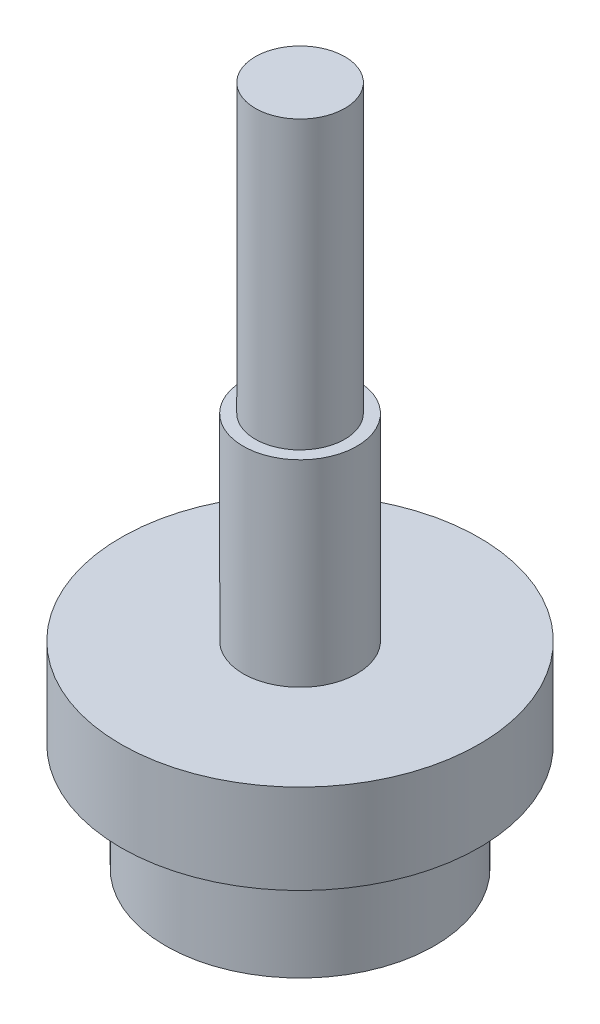
ISO-10303-21;
HEADER;
FILE_DESCRIPTION(('STEP AP214'),'2;1');
FILE_NAME('part.step','',(''),(''),'','','');
FILE_SCHEMA(('AUTOMOTIVE_DESIGN { 1 0 10303 214 1 1 1 1 }'));
ENDSEC;
DATA;
#1=APPLICATION_CONTEXT('core data for automotive mechanical design processes');
#2=APPLICATION_PROTOCOL_DEFINITION('international standard','automotive_design',2000,#1);
#3=PRODUCT_CONTEXT('',#1,'mechanical');
#4=PRODUCT('Part','Part','',(#3));
#5=PRODUCT_RELATED_PRODUCT_CATEGORY('part','',(#4));
#6=PRODUCT_DEFINITION_FORMATION('','',#4);
#7=PRODUCT_DEFINITION_CONTEXT('part definition',#1,'design');
#8=PRODUCT_DEFINITION('design','',#6,#7);
#9=PRODUCT_DEFINITION_SHAPE('','',#8);
#10=(LENGTH_UNIT() NAMED_UNIT(*) SI_UNIT(.MILLI.,.METRE.));
#11=(NAMED_UNIT(*) PLANE_ANGLE_UNIT() SI_UNIT($,.RADIAN.));
#12=(NAMED_UNIT(*) SI_UNIT($,.STERADIAN.) SOLID_ANGLE_UNIT());
#13=UNCERTAINTY_MEASURE_WITH_UNIT(LENGTH_MEASURE(1.E-05),#10,'distance_accuracy_value','');
#14=(GEOMETRIC_REPRESENTATION_CONTEXT(3) GLOBAL_UNCERTAINTY_ASSIGNED_CONTEXT((#13)) GLOBAL_UNIT_ASSIGNED_CONTEXT((#10,
#11,#12)) REPRESENTATION_CONTEXT('',''));
#15=CARTESIAN_POINT('',(0.,0.,0.));
#16=DIRECTION('',(0.,0.,1.));
#17=DIRECTION('',(1.,0.,0.));
#18=AXIS2_PLACEMENT_3D('',#15,#16,#17);
#19=CARTESIAN_POINT('',(0.,4.,0.));
#20=DIRECTION('',(0.,-1.,0.));
#21=DIRECTION('',(0.,0.,-1.));
#22=AXIS2_PLACEMENT_3D('',#19,#20,#21);
#23=CYLINDRICAL_SURFACE('',#22,2.5);
#24=CARTESIAN_POINT('',(0.,4.,0.));
#25=DIRECTION('',(0.,1.,0.));
#26=DIRECTION('',(0.,0.,1.));
#27=AXIS2_PLACEMENT_3D('',#24,#25,#26);
#28=CIRCLE('',#27,2.5);
#29=CARTESIAN_POINT('',(0.,4.,2.5));
#30=VERTEX_POINT('',#29);
#31=EDGE_CURVE('E39',#30,#30,#28,.T.);
#32=ORIENTED_EDGE('',*,*,#31,.F.);
#33=EDGE_LOOP('',(#32));
#34=FACE_BOUND('',#33,.T.);
#35=CARTESIAN_POINT('',(0.,1.,0.));
#36=DIRECTION('',(0.,-1.,0.));
#37=DIRECTION('',(0.,0.,-1.));
#38=AXIS2_PLACEMENT_3D('',#35,#36,#37);
#39=CIRCLE('',#38,2.5);
#40=CARTESIAN_POINT('',(0.,1.,-2.5));
#41=VERTEX_POINT('',#40);
#42=EDGE_CURVE('E88',#41,#41,#39,.T.);
#43=ORIENTED_EDGE('',*,*,#42,.F.);
#44=EDGE_LOOP('',(#43));
#45=FACE_BOUND('',#44,.T.);
#46=ADVANCED_FACE('F36',(#34,#45),#23,.T.);
#47=CARTESIAN_POINT('',(0.,10.,0.));
#48=DIRECTION('',(0.,-1.,0.));
#49=DIRECTION('',(0.,0.,-1.));
#50=AXIS2_PLACEMENT_3D('',#47,#48,#49);
#51=CYLINDRICAL_SURFACE('',#50,7.5);
#52=CARTESIAN_POINT('',(0.,10.,0.));
#53=DIRECTION('',(0.,1.,0.));
#54=DIRECTION('',(0.,0.,1.));
#55=AXIS2_PLACEMENT_3D('',#52,#53,#54);
#56=CIRCLE('',#55,7.5);
#57=CARTESIAN_POINT('',(0.,10.,7.5));
#58=VERTEX_POINT('',#57);
#59=EDGE_CURVE('E47',#58,#58,#56,.T.);
#60=ORIENTED_EDGE('',*,*,#59,.F.);
#61=EDGE_LOOP('',(#60));
#62=FACE_BOUND('',#61,.T.);
#63=CARTESIAN_POINT('',(0.,4.,0.));
#64=DIRECTION('',(0.,1.,0.));
#65=DIRECTION('',(0.,0.,1.));
#66=AXIS2_PLACEMENT_3D('',#63,#64,#65);
#67=CIRCLE('',#66,7.5);
#68=CARTESIAN_POINT('',(0.,4.,7.5));
#69=VERTEX_POINT('',#68);
#70=EDGE_CURVE('E55',#69,#69,#67,.T.);
#71=ORIENTED_EDGE('',*,*,#70,.T.);
#72=EDGE_LOOP('',(#71));
#73=FACE_BOUND('',#72,.T.);
#74=ADVANCED_FACE('F63',(#62,#73),#51,.T.);
#75=CARTESIAN_POINT('',(0.,4.,0.));
#76=DIRECTION('',(0.,1.,0.));
#77=DIRECTION('',(0.,0.,1.));
#78=AXIS2_PLACEMENT_3D('',#75,#76,#77);
#79=PLANE('',#78);
#80=ORIENTED_EDGE('',*,*,#31,.T.);
#81=EDGE_LOOP('',(#80));
#82=FACE_BOUND('',#81,.T.);
#83=ORIENTED_EDGE('',*,*,#70,.F.);
#84=EDGE_LOOP('',(#83));
#85=FACE_BOUND('',#84,.T.);
#86=ADVANCED_FACE('F65',(#82,#85),#79,.F.);
#87=CARTESIAN_POINT('',(0.,15.,0.));
#88=DIRECTION('',(0.,-1.,0.));
#89=DIRECTION('',(0.,0.,-1.));
#90=AXIS2_PLACEMENT_3D('',#87,#88,#89);
#91=CYLINDRICAL_SURFACE('',#90,10.);
#92=CARTESIAN_POINT('',(0.,15.,0.));
#93=DIRECTION('',(0.,1.,0.));
#94=DIRECTION('',(0.,0.,1.));
#95=AXIS2_PLACEMENT_3D('',#92,#93,#94);
#96=CIRCLE('',#95,10.);
#97=CARTESIAN_POINT('',(0.,15.,10.));
#98=VERTEX_POINT('',#97);
#99=EDGE_CURVE('E52',#98,#98,#96,.T.);
#100=ORIENTED_EDGE('',*,*,#99,.F.);
#101=EDGE_LOOP('',(#100));
#102=FACE_BOUND('',#101,.T.);
#103=CARTESIAN_POINT('',(0.,10.,0.));
#104=DIRECTION('',(0.,1.,0.));
#105=DIRECTION('',(0.,0.,1.));
#106=AXIS2_PLACEMENT_3D('',#103,#104,#105);
#107=CIRCLE('',#106,10.);
#108=CARTESIAN_POINT('',(0.,10.,10.));
#109=VERTEX_POINT('',#108);
#110=EDGE_CURVE('E56',#109,#109,#107,.T.);
#111=ORIENTED_EDGE('',*,*,#110,.T.);
#112=EDGE_LOOP('',(#111));
#113=FACE_BOUND('',#112,.T.);
#114=ADVANCED_FACE('F67',(#102,#113),#91,.T.);
#115=CARTESIAN_POINT('',(0.,15.,0.));
#116=DIRECTION('',(0.,1.,0.));
#117=DIRECTION('',(0.,0.,1.));
#118=AXIS2_PLACEMENT_3D('',#115,#116,#117);
#119=PLANE('',#118);
#120=CARTESIAN_POINT('',(0.,15.,0.));
#121=DIRECTION('',(0.,1.,0.));
#122=DIRECTION('',(0.,0.,1.));
#123=AXIS2_PLACEMENT_3D('',#120,#121,#122);
#124=CIRCLE('',#123,3.175);
#125=CARTESIAN_POINT('',(0.,15.,3.175));
#126=VERTEX_POINT('',#125);
#127=EDGE_CURVE('E10',#126,#126,#124,.T.);
#128=ORIENTED_EDGE('',*,*,#127,.F.);
#129=EDGE_LOOP('',(#128));
#130=FACE_BOUND('',#129,.T.);
#131=ORIENTED_EDGE('',*,*,#99,.T.);
#132=EDGE_LOOP('',(#131));
#133=FACE_BOUND('',#132,.T.);
#134=ADVANCED_FACE('F74',(#130,#133),#119,.T.);
#135=CARTESIAN_POINT('',(0.,10.,0.));
#136=DIRECTION('',(0.,1.,0.));
#137=DIRECTION('',(0.,0.,1.));
#138=AXIS2_PLACEMENT_3D('',#135,#136,#137);
#139=PLANE('',#138);
#140=ORIENTED_EDGE('',*,*,#59,.T.);
#141=EDGE_LOOP('',(#140));
#142=FACE_BOUND('',#141,.T.);
#143=ORIENTED_EDGE('',*,*,#110,.F.);
#144=EDGE_LOOP('',(#143));
#145=FACE_BOUND('',#144,.T.);
#146=ADVANCED_FACE('F120',(#142,#145),#139,.F.);
#147=CARTESIAN_POINT('',(0.,26.,0.));
#148=DIRECTION('',(0.,-1.,0.));
#149=DIRECTION('',(0.,0.,-1.));
#150=AXIS2_PLACEMENT_3D('',#147,#148,#149);
#151=CYLINDRICAL_SURFACE('',#150,3.175);
#152=CARTESIAN_POINT('',(0.,26.,0.));
#153=DIRECTION('',(0.,-1.,0.));
#154=DIRECTION('',(0.,0.,-1.));
#155=AXIS2_PLACEMENT_3D('',#152,#153,#154);
#156=CIRCLE('',#155,3.175);
#157=CARTESIAN_POINT('',(0.,26.,-3.175));
#158=VERTEX_POINT('',#157);
#159=EDGE_CURVE('E90',#158,#158,#156,.T.);
#160=ORIENTED_EDGE('',*,*,#159,.T.);
#161=EDGE_LOOP('',(#160));
#162=FACE_BOUND('',#161,.T.);
#163=ORIENTED_EDGE('',*,*,#127,.T.);
#164=EDGE_LOOP('',(#163));
#165=FACE_BOUND('',#164,.T.);
#166=ADVANCED_FACE('F116',(#162,#165),#151,.T.);
#167=CARTESIAN_POINT('',(0.,1.,0.));
#168=DIRECTION('',(0.,-1.,0.));
#169=DIRECTION('',(0.,0.,-1.));
#170=AXIS2_PLACEMENT_3D('',#167,#168,#169);
#171=PLANE('',#170);
#172=ORIENTED_EDGE('',*,*,#42,.T.);
#173=EDGE_LOOP('',(#172));
#174=FACE_BOUND('',#173,.T.);
#175=ADVANCED_FACE('F119',(#174),#171,.T.);
#176=CARTESIAN_POINT('',(0.,26.,0.));
#177=DIRECTION('',(0.,-1.,0.));
#178=DIRECTION('',(0.,0.,-1.));
#179=AXIS2_PLACEMENT_3D('',#176,#177,#178);
#180=PLANE('',#179);
#181=CARTESIAN_POINT('',(0.,26.,0.));
#182=DIRECTION('',(0.,-1.,0.));
#183=DIRECTION('',(0.,0.,-1.));
#184=AXIS2_PLACEMENT_3D('',#181,#182,#183);
#185=CIRCLE('',#184,2.5);
#186=CARTESIAN_POINT('',(0.,26.,-2.5));
#187=VERTEX_POINT('',#186);
#188=EDGE_CURVE('E93',#187,#187,#185,.T.);
#189=ORIENTED_EDGE('',*,*,#188,.T.);
#190=EDGE_LOOP('',(#189));
#191=FACE_BOUND('',#190,.T.);
#192=ORIENTED_EDGE('',*,*,#159,.F.);
#193=EDGE_LOOP('',(#192));
#194=FACE_BOUND('',#193,.T.);
#195=ADVANCED_FACE('F99',(#191,#194),#180,.F.);
#196=CARTESIAN_POINT('',(0.,42.,0.));
#197=DIRECTION('',(0.,1.,0.));
#198=DIRECTION('',(0.,0.,1.));
#199=AXIS2_PLACEMENT_3D('',#196,#197,#198);
#200=PLANE('',#199);
#201=CARTESIAN_POINT('',(0.,42.,0.));
#202=DIRECTION('',(0.,1.,0.));
#203=DIRECTION('',(0.,0.,1.));
#204=AXIS2_PLACEMENT_3D('',#201,#202,#203);
#205=CIRCLE('',#204,2.5);
#206=CARTESIAN_POINT('',(0.,42.,2.5));
#207=VERTEX_POINT('',#206);
#208=EDGE_CURVE('E50',#207,#207,#205,.T.);
#209=ORIENTED_EDGE('',*,*,#208,.T.);
#210=EDGE_LOOP('',(#209));
#211=FACE_BOUND('',#210,.T.);
#212=ADVANCED_FACE('F104',(#211),#200,.T.);
#213=CARTESIAN_POINT('',(0.,42.,0.));
#214=DIRECTION('',(0.,-1.,0.));
#215=DIRECTION('',(0.,0.,-1.));
#216=AXIS2_PLACEMENT_3D('',#213,#214,#215);
#217=CYLINDRICAL_SURFACE('',#216,2.5);
#218=ORIENTED_EDGE('',*,*,#208,.F.);
#219=EDGE_LOOP('',(#218));
#220=FACE_BOUND('',#219,.T.);
#221=ORIENTED_EDGE('',*,*,#188,.F.);
#222=EDGE_LOOP('',(#221));
#223=FACE_BOUND('',#222,.T.);
#224=ADVANCED_FACE('F102',(#220,#223),#217,.T.);
#225=CLOSED_SHELL('',(#46,#74,#86,#114,#134,#146,#166,#175,#195,#212,#224));
#226=MANIFOLD_SOLID_BREP('B2',#225);
#227=ADVANCED_BREP_SHAPE_REPRESENTATION('',(#18,#226),#14);
#228=SHAPE_DEFINITION_REPRESENTATION(#9,#227);
ENDSEC;
END-ISO-10303-21;
